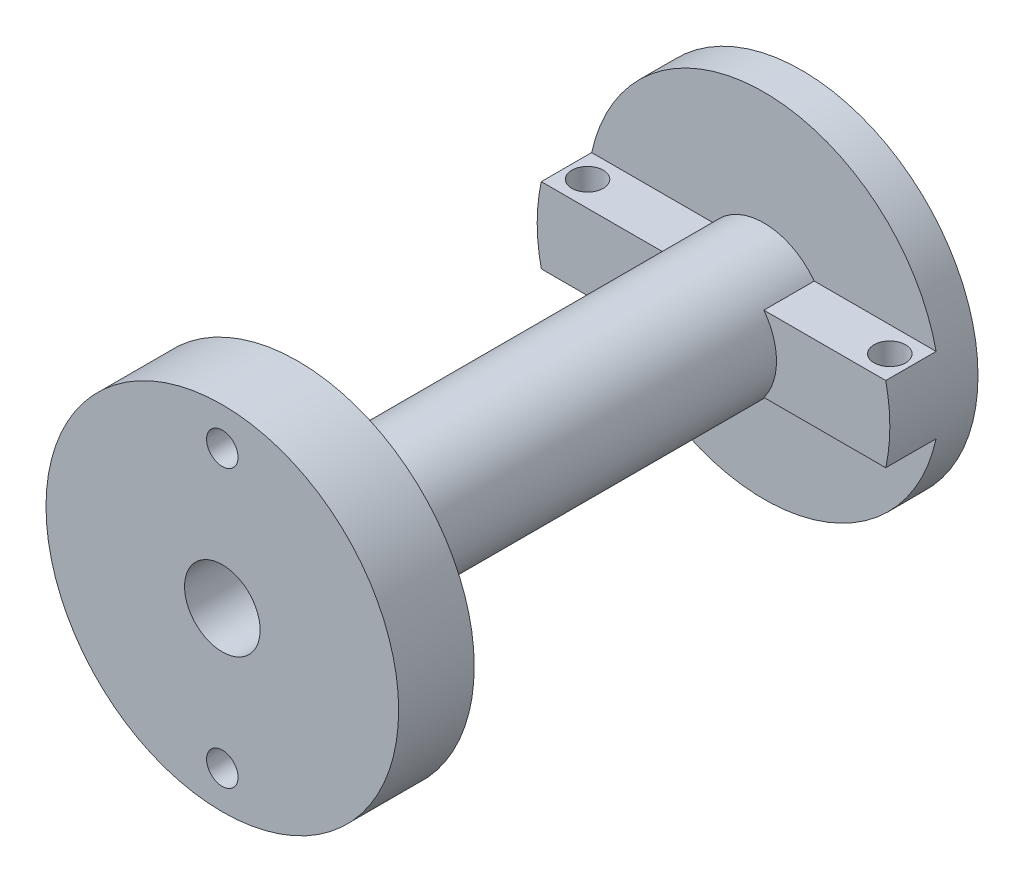
ISO-10303-21;
HEADER;
FILE_DESCRIPTION(('STEP AP214'),'2;1');
FILE_NAME('part.step','',(''),(''),'','','');
FILE_SCHEMA(('AUTOMOTIVE_DESIGN { 1 0 10303 214 1 1 1 1 }'));
ENDSEC;
DATA;
#1=APPLICATION_CONTEXT('core data for automotive mechanical design processes');
#2=APPLICATION_PROTOCOL_DEFINITION('international standard','automotive_design',2000,#1);
#3=PRODUCT_CONTEXT('',#1,'mechanical');
#4=PRODUCT('Part','Part','',(#3));
#5=PRODUCT_RELATED_PRODUCT_CATEGORY('part','',(#4));
#6=PRODUCT_DEFINITION_FORMATION('','',#4);
#7=PRODUCT_DEFINITION_CONTEXT('part definition',#1,'design');
#8=PRODUCT_DEFINITION('design','',#6,#7);
#9=PRODUCT_DEFINITION_SHAPE('','',#8);
#10=(LENGTH_UNIT() NAMED_UNIT(*) SI_UNIT(.MILLI.,.METRE.));
#11=(NAMED_UNIT(*) PLANE_ANGLE_UNIT() SI_UNIT($,.RADIAN.));
#12=(NAMED_UNIT(*) SI_UNIT($,.STERADIAN.) SOLID_ANGLE_UNIT());
#13=UNCERTAINTY_MEASURE_WITH_UNIT(LENGTH_MEASURE(1.E-05),#10,'distance_accuracy_value','');
#14=(GEOMETRIC_REPRESENTATION_CONTEXT(3) GLOBAL_UNCERTAINTY_ASSIGNED_CONTEXT((#13)) GLOBAL_UNIT_ASSIGNED_CONTEXT((#10,
#11,#12)) REPRESENTATION_CONTEXT('',''));
#15=CARTESIAN_POINT('',(0.,0.,0.));
#16=DIRECTION('',(0.,0.,1.));
#17=DIRECTION('',(1.,0.,0.));
#18=AXIS2_PLACEMENT_3D('',#15,#16,#17);
#19=CARTESIAN_POINT('',(0.,0.,1.5));
#20=DIRECTION('',(0.,0.,1.));
#21=DIRECTION('',(1.,0.,0.));
#22=AXIS2_PLACEMENT_3D('',#19,#20,#21);
#23=PLANE('',#22);
#24=CARTESIAN_POINT('',(0.,0.,1.5));
#25=DIRECTION('',(0.,0.,1.));
#26=DIRECTION('',(1.,0.,0.));
#27=AXIS2_PLACEMENT_3D('',#24,#25,#26);
#28=CIRCLE('',#27,7.);
#29=CARTESIAN_POINT('',(-6.83739716558867,-1.5,1.5));
#30=VERTEX_POINT('',#29);
#31=CARTESIAN_POINT('',(6.83739716558867,-1.5,1.5));
#32=VERTEX_POINT('',#31);
#33=EDGE_CURVE('E127',#30,#32,#28,.T.);
#34=ORIENTED_EDGE('',*,*,#33,.T.);
#35=DIRECTION('',(1.,0.,0.));
#36=VECTOR('',#35,1.);
#37=CARTESIAN_POINT('',(6.83739716558867,-1.5,1.5));
#38=LINE('',#37,#36);
#39=CARTESIAN_POINT('',(2.,-1.5,1.5));
#40=VERTEX_POINT('',#39);
#41=EDGE_CURVE('E252',#40,#32,#38,.T.);
#42=ORIENTED_EDGE('',*,*,#41,.F.);
#43=CARTESIAN_POINT('',(0.,0.,1.5));
#44=DIRECTION('',(0.,0.,1.));
#45=DIRECTION('',(1.,0.,0.));
#46=AXIS2_PLACEMENT_3D('',#43,#44,#45);
#47=CIRCLE('',#46,2.5);
#48=CARTESIAN_POINT('',(-2.,-1.5,1.5));
#49=VERTEX_POINT('',#48);
#50=EDGE_CURVE('E46',#49,#40,#47,.T.);
#51=ORIENTED_EDGE('',*,*,#50,.F.);
#52=EDGE_CURVE('E254',#30,#49,#38,.T.);
#53=ORIENTED_EDGE('',*,*,#52,.F.);
#54=EDGE_LOOP('',(#34,#42,#51,#53));
#55=FACE_BOUND('',#54,.T.);
#56=ADVANCED_FACE('F37',(#55),#23,.T.);
#57=CARTESIAN_POINT('',(6.83739716558867,1.5,1.5));
#58=VERTEX_POINT('',#57);
#59=CARTESIAN_POINT('',(-6.83739716558867,1.5,1.5));
#60=VERTEX_POINT('',#59);
#61=EDGE_CURVE('E171',#58,#60,#28,.T.);
#62=ORIENTED_EDGE('',*,*,#61,.T.);
#63=DIRECTION('',(-1.,0.,0.));
#64=VECTOR('',#63,1.);
#65=CARTESIAN_POINT('',(6.83739716558867,1.5,1.5));
#66=LINE('',#65,#64);
#67=CARTESIAN_POINT('',(-2.,1.5,1.5));
#68=VERTEX_POINT('',#67);
#69=EDGE_CURVE('E267',#68,#60,#66,.T.);
#70=ORIENTED_EDGE('',*,*,#69,.F.);
#71=CARTESIAN_POINT('',(2.,1.5,1.5));
#72=VERTEX_POINT('',#71);
#73=EDGE_CURVE('E11',#72,#68,#47,.T.);
#74=ORIENTED_EDGE('',*,*,#73,.F.);
#75=EDGE_CURVE('E120',#58,#72,#66,.T.);
#76=ORIENTED_EDGE('',*,*,#75,.F.);
#77=EDGE_LOOP('',(#62,#70,#74,#76));
#78=FACE_BOUND('',#77,.T.);
#79=ADVANCED_FACE('F197',(#78),#23,.T.);
#80=CARTESIAN_POINT('',(0.,0.,20.));
#81=DIRECTION('',(0.,0.,-1.));
#82=DIRECTION('',(-1.,0.,0.));
#83=AXIS2_PLACEMENT_3D('',#80,#81,#82);
#84=CYLINDRICAL_SURFACE('',#83,2.5);
#85=CARTESIAN_POINT('',(0.,0.,20.));
#86=DIRECTION('',(0.,0.,1.));
#87=DIRECTION('',(1.,0.,0.));
#88=AXIS2_PLACEMENT_3D('',#85,#86,#87);
#89=CIRCLE('',#88,2.5);
#90=CARTESIAN_POINT('',(2.5,0.,20.));
#91=VERTEX_POINT('',#90);
#92=EDGE_CURVE('E167',#91,#91,#89,.T.);
#93=ORIENTED_EDGE('',*,*,#92,.F.);
#94=EDGE_LOOP('',(#93));
#95=FACE_BOUND('',#94,.T.);
#96=DIRECTION('',(0.,0.,-1.));
#97=VECTOR('',#96,1.);
#98=CARTESIAN_POINT('',(-2.,-1.5,20.));
#99=LINE('',#98,#97);
#100=CARTESIAN_POINT('',(-2.,-1.5,3.5));
#101=VERTEX_POINT('',#100);
#102=EDGE_CURVE('E107',#49,#101,#99,.F.);
#103=ORIENTED_EDGE('',*,*,#102,.F.);
#104=ORIENTED_EDGE('',*,*,#50,.T.);
#105=DIRECTION('',(0.,0.,-1.));
#106=VECTOR('',#105,1.);
#107=CARTESIAN_POINT('',(2.,-1.5,20.));
#108=LINE('',#107,#106);
#109=CARTESIAN_POINT('',(2.,-1.5,3.5));
#110=VERTEX_POINT('',#109);
#111=EDGE_CURVE('E143',#110,#40,#108,.T.);
#112=ORIENTED_EDGE('',*,*,#111,.F.);
#113=CARTESIAN_POINT('',(0.,0.,3.5));
#114=DIRECTION('',(0.,0.,1.));
#115=DIRECTION('',(1.,0.,0.));
#116=AXIS2_PLACEMENT_3D('',#113,#114,#115);
#117=CIRCLE('',#116,2.5);
#118=CARTESIAN_POINT('',(2.,1.5,3.5));
#119=VERTEX_POINT('',#118);
#120=EDGE_CURVE('E128',#110,#119,#117,.T.);
#121=ORIENTED_EDGE('',*,*,#120,.T.);
#122=DIRECTION('',(0.,0.,-1.));
#123=VECTOR('',#122,1.);
#124=CARTESIAN_POINT('',(2.,1.5,20.));
#125=LINE('',#124,#123);
#126=EDGE_CURVE('E138',#72,#119,#125,.F.);
#127=ORIENTED_EDGE('',*,*,#126,.F.);
#128=ORIENTED_EDGE('',*,*,#73,.T.);
#129=DIRECTION('',(0.,0.,-1.));
#130=VECTOR('',#129,1.);
#131=CARTESIAN_POINT('',(-2.,1.5,20.));
#132=LINE('',#131,#130);
#133=CARTESIAN_POINT('',(-2.,1.5,3.5));
#134=VERTEX_POINT('',#133);
#135=EDGE_CURVE('E140',#134,#68,#132,.T.);
#136=ORIENTED_EDGE('',*,*,#135,.F.);
#137=EDGE_CURVE('E132',#134,#101,#117,.T.);
#138=ORIENTED_EDGE('',*,*,#137,.T.);
#139=EDGE_LOOP('',(#103,#104,#112,#121,#127,#128,#136,#138));
#140=FACE_BOUND('',#139,.T.);
#141=ADVANCED_FACE('F193',(#95,#140),#84,.T.);
#142=CARTESIAN_POINT('',(0.,0.,1.5));
#143=DIRECTION('',(0.,0.,-1.));
#144=DIRECTION('',(-1.,0.,0.));
#145=AXIS2_PLACEMENT_3D('',#142,#143,#144);
#146=CYLINDRICAL_SURFACE('',#145,7.);
#147=ORIENTED_EDGE('',*,*,#61,.F.);
#148=DIRECTION('',(0.,0.,-1.));
#149=VECTOR('',#148,1.);
#150=CARTESIAN_POINT('',(6.83739716558867,1.5,3.5));
#151=LINE('',#150,#149);
#152=CARTESIAN_POINT('',(6.83739716558867,1.5,3.5));
#153=VERTEX_POINT('',#152);
#154=EDGE_CURVE('E134',#153,#58,#151,.T.);
#155=ORIENTED_EDGE('',*,*,#154,.F.);
#156=CARTESIAN_POINT('',(0.,0.,3.5));
#157=DIRECTION('',(0.,0.,1.));
#158=DIRECTION('',(1.,0.,0.));
#159=AXIS2_PLACEMENT_3D('',#156,#157,#158);
#160=CIRCLE('',#159,7.);
#161=CARTESIAN_POINT('',(6.83739716558867,-1.5,3.5));
#162=VERTEX_POINT('',#161);
#163=EDGE_CURVE('E109',#162,#153,#160,.T.);
#164=ORIENTED_EDGE('',*,*,#163,.F.);
#165=DIRECTION('',(0.,0.,-1.));
#166=VECTOR('',#165,1.);
#167=CARTESIAN_POINT('',(6.83739716558867,-1.5,3.5));
#168=LINE('',#167,#166);
#169=EDGE_CURVE('E129',#162,#32,#168,.T.);
#170=ORIENTED_EDGE('',*,*,#169,.T.);
#171=ORIENTED_EDGE('',*,*,#33,.F.);
#172=DIRECTION('',(0.,0.,-1.));
#173=VECTOR('',#172,1.);
#174=CARTESIAN_POINT('',(-6.83739716558867,-1.5,3.5));
#175=LINE('',#174,#173);
#176=CARTESIAN_POINT('',(-6.83739716558867,-1.5,3.5));
#177=VERTEX_POINT('',#176);
#178=EDGE_CURVE('E104',#177,#30,#175,.T.);
#179=ORIENTED_EDGE('',*,*,#178,.F.);
#180=CARTESIAN_POINT('',(0.,0.,3.5));
#181=DIRECTION('',(0.,0.,1.));
#182=DIRECTION('',(1.,0.,0.));
#183=AXIS2_PLACEMENT_3D('',#180,#181,#182);
#184=CIRCLE('',#183,7.);
#185=CARTESIAN_POINT('',(-6.83739716558867,1.5,3.5));
#186=VERTEX_POINT('',#185);
#187=EDGE_CURVE('E113',#186,#177,#184,.T.);
#188=ORIENTED_EDGE('',*,*,#187,.F.);
#189=DIRECTION('',(0.,0.,-1.));
#190=VECTOR('',#189,1.);
#191=CARTESIAN_POINT('',(-6.83739716558867,1.5,3.5));
#192=LINE('',#191,#190);
#193=EDGE_CURVE('E265',#186,#60,#192,.T.);
#194=ORIENTED_EDGE('',*,*,#193,.T.);
#195=EDGE_LOOP('',(#147,#155,#164,#170,#171,#179,#188,#194));
#196=FACE_BOUND('',#195,.T.);
#197=CARTESIAN_POINT('',(0.,0.,0.));
#198=DIRECTION('',(0.,0.,1.));
#199=DIRECTION('',(1.,0.,0.));
#200=AXIS2_PLACEMENT_3D('',#197,#198,#199);
#201=CIRCLE('',#200,7.);
#202=CARTESIAN_POINT('',(7.,0.,0.));
#203=VERTEX_POINT('',#202);
#204=EDGE_CURVE('E41',#203,#203,#201,.T.);
#205=ORIENTED_EDGE('',*,*,#204,.T.);
#206=EDGE_LOOP('',(#205));
#207=FACE_BOUND('',#206,.T.);
#208=ADVANCED_FACE('F39',(#196,#207),#146,.T.);
#209=CARTESIAN_POINT('',(0.,0.,0.));
#210=DIRECTION('',(0.,0.,1.));
#211=DIRECTION('',(1.,0.,0.));
#212=AXIS2_PLACEMENT_3D('',#209,#210,#211);
#213=PLANE('',#212);
#214=CARTESIAN_POINT('',(0.,0.,0.));
#215=DIRECTION('',(0.,0.,-1.));
#216=DIRECTION('',(-1.,0.,0.));
#217=AXIS2_PLACEMENT_3D('',#214,#215,#216);
#218=CIRCLE('',#217,1.5);
#219=CARTESIAN_POINT('',(-1.5,0.,0.));
#220=VERTEX_POINT('',#219);
#221=EDGE_CURVE('E158',#220,#220,#218,.T.);
#222=ORIENTED_EDGE('',*,*,#221,.F.);
#223=EDGE_LOOP('',(#222));
#224=FACE_BOUND('',#223,.T.);
#225=ORIENTED_EDGE('',*,*,#204,.F.);
#226=EDGE_LOOP('',(#225));
#227=FACE_BOUND('',#226,.T.);
#228=ADVANCED_FACE('F182',(#224,#227),#213,.F.);
#229=CARTESIAN_POINT('',(0.,0.,23.));
#230=DIRECTION('',(0.,0.,-1.));
#231=DIRECTION('',(-1.,0.,0.));
#232=AXIS2_PLACEMENT_3D('',#229,#230,#231);
#233=CYLINDRICAL_SURFACE('',#232,7.);
#234=CARTESIAN_POINT('',(0.,0.,23.));
#235=DIRECTION('',(0.,0.,1.));
#236=DIRECTION('',(1.,0.,0.));
#237=AXIS2_PLACEMENT_3D('',#234,#235,#236);
#238=CIRCLE('',#237,7.);
#239=CARTESIAN_POINT('',(7.,0.,23.));
#240=VERTEX_POINT('',#239);
#241=EDGE_CURVE('E164',#240,#240,#238,.T.);
#242=ORIENTED_EDGE('',*,*,#241,.F.);
#243=EDGE_LOOP('',(#242));
#244=FACE_BOUND('',#243,.T.);
#245=CARTESIAN_POINT('',(0.,0.,20.));
#246=DIRECTION('',(0.,0.,1.));
#247=DIRECTION('',(1.,0.,0.));
#248=AXIS2_PLACEMENT_3D('',#245,#246,#247);
#249=CIRCLE('',#248,7.);
#250=CARTESIAN_POINT('',(7.,0.,20.));
#251=VERTEX_POINT('',#250);
#252=EDGE_CURVE('E161',#251,#251,#249,.T.);
#253=ORIENTED_EDGE('',*,*,#252,.T.);
#254=EDGE_LOOP('',(#253));
#255=FACE_BOUND('',#254,.T.);
#256=ADVANCED_FACE('F184',(#244,#255),#233,.T.);
#257=CARTESIAN_POINT('',(0.,0.,23.));
#258=DIRECTION('',(0.,0.,1.));
#259=DIRECTION('',(1.,0.,0.));
#260=AXIS2_PLACEMENT_3D('',#257,#258,#259);
#261=PLANE('',#260);
#262=CARTESIAN_POINT('',(0.,5.5,23.));
#263=DIRECTION('',(0.,0.,1.));
#264=DIRECTION('',(1.,0.,0.));
#265=AXIS2_PLACEMENT_3D('',#262,#263,#264);
#266=CIRCLE('',#265,0.625);
#267=CARTESIAN_POINT('',(0.625,5.5,23.));
#268=VERTEX_POINT('',#267);
#269=EDGE_CURVE('E149',#268,#268,#266,.T.);
#270=ORIENTED_EDGE('',*,*,#269,.F.);
#271=EDGE_LOOP('',(#270));
#272=FACE_BOUND('',#271,.T.);
#273=CARTESIAN_POINT('',(0.,-5.5,23.));
#274=DIRECTION('',(0.,0.,1.));
#275=DIRECTION('',(-1.,0.,0.));
#276=AXIS2_PLACEMENT_3D('',#273,#274,#275);
#277=CIRCLE('',#276,0.625);
#278=CARTESIAN_POINT('',(-0.625,-5.5,23.));
#279=VERTEX_POINT('',#278);
#280=EDGE_CURVE('E145',#279,#279,#277,.T.);
#281=ORIENTED_EDGE('',*,*,#280,.F.);
#282=EDGE_LOOP('',(#281));
#283=FACE_BOUND('',#282,.T.);
#284=CARTESIAN_POINT('',(0.,0.,23.));
#285=DIRECTION('',(0.,0.,1.));
#286=DIRECTION('',(1.,0.,0.));
#287=AXIS2_PLACEMENT_3D('',#284,#285,#286);
#288=CIRCLE('',#287,1.5);
#289=CARTESIAN_POINT('',(1.5,0.,23.));
#290=VERTEX_POINT('',#289);
#291=EDGE_CURVE('E153',#290,#290,#288,.F.);
#292=ORIENTED_EDGE('',*,*,#291,.T.);
#293=EDGE_LOOP('',(#292));
#294=FACE_BOUND('',#293,.T.);
#295=ORIENTED_EDGE('',*,*,#241,.T.);
#296=EDGE_LOOP('',(#295));
#297=FACE_BOUND('',#296,.T.);
#298=ADVANCED_FACE('F190',(#272,#283,#294,#297),#261,.T.);
#299=CARTESIAN_POINT('',(0.,0.,20.));
#300=DIRECTION('',(0.,0.,1.));
#301=DIRECTION('',(1.,0.,0.));
#302=AXIS2_PLACEMENT_3D('',#299,#300,#301);
#303=PLANE('',#302);
#304=CARTESIAN_POINT('',(0.,5.5,20.));
#305=DIRECTION('',(0.,0.,1.));
#306=DIRECTION('',(1.,0.,0.));
#307=AXIS2_PLACEMENT_3D('',#304,#305,#306);
#308=CIRCLE('',#307,0.625);
#309=CARTESIAN_POINT('',(0.625,5.5,20.));
#310=VERTEX_POINT('',#309);
#311=EDGE_CURVE('E146',#310,#310,#308,.F.);
#312=ORIENTED_EDGE('',*,*,#311,.F.);
#313=EDGE_LOOP('',(#312));
#314=FACE_BOUND('',#313,.T.);
#315=CARTESIAN_POINT('',(0.,-5.5,20.));
#316=DIRECTION('',(0.,0.,1.));
#317=DIRECTION('',(1.,0.,0.));
#318=AXIS2_PLACEMENT_3D('',#315,#316,#317);
#319=CIRCLE('',#318,0.625);
#320=CARTESIAN_POINT('',(0.625,-5.5,20.));
#321=VERTEX_POINT('',#320);
#322=EDGE_CURVE('E150',#321,#321,#319,.F.);
#323=ORIENTED_EDGE('',*,*,#322,.F.);
#324=EDGE_LOOP('',(#323));
#325=FACE_BOUND('',#324,.T.);
#326=ORIENTED_EDGE('',*,*,#92,.T.);
#327=EDGE_LOOP('',(#326));
#328=FACE_BOUND('',#327,.T.);
#329=ORIENTED_EDGE('',*,*,#252,.F.);
#330=EDGE_LOOP('',(#329));
#331=FACE_BOUND('',#330,.T.);
#332=ADVANCED_FACE('F205',(#314,#325,#328,#331),#303,.F.);
#333=CARTESIAN_POINT('',(0.,0.,23.001));
#334=DIRECTION('',(0.,0.,-1.));
#335=DIRECTION('',(-1.,0.,0.));
#336=AXIS2_PLACEMENT_3D('',#333,#334,#335);
#337=CYLINDRICAL_SURFACE('',#336,1.5);
#338=ORIENTED_EDGE('',*,*,#291,.F.);
#339=EDGE_LOOP('',(#338));
#340=FACE_BOUND('',#339,.T.);
#341=ORIENTED_EDGE('',*,*,#221,.T.);
#342=EDGE_LOOP('',(#341));
#343=FACE_BOUND('',#342,.T.);
#344=ADVANCED_FACE('F208',(#340,#343),#337,.F.);
#345=CARTESIAN_POINT('',(0.,-5.5,-0.001000000000001));
#346=DIRECTION('',(0.,0.,1.));
#347=DIRECTION('',(1.,0.,0.));
#348=AXIS2_PLACEMENT_3D('',#345,#346,#347);
#349=CYLINDRICAL_SURFACE('',#348,0.625);
#350=ORIENTED_EDGE('',*,*,#280,.T.);
#351=EDGE_LOOP('',(#350));
#352=FACE_BOUND('',#351,.T.);
#353=ORIENTED_EDGE('',*,*,#322,.T.);
#354=EDGE_LOOP('',(#353));
#355=FACE_BOUND('',#354,.T.);
#356=ADVANCED_FACE('F215',(#352,#355),#349,.F.);
#357=CARTESIAN_POINT('',(0.,5.5,-0.001000000000001));
#358=DIRECTION('',(0.,0.,1.));
#359=DIRECTION('',(1.,0.,0.));
#360=AXIS2_PLACEMENT_3D('',#357,#358,#359);
#361=CYLINDRICAL_SURFACE('',#360,0.625);
#362=ORIENTED_EDGE('',*,*,#269,.T.);
#363=EDGE_LOOP('',(#362));
#364=FACE_BOUND('',#363,.T.);
#365=ORIENTED_EDGE('',*,*,#311,.T.);
#366=EDGE_LOOP('',(#365));
#367=FACE_BOUND('',#366,.T.);
#368=ADVANCED_FACE('F219',(#364,#367),#361,.F.);
#369=CARTESIAN_POINT('',(0.,0.,3.5));
#370=DIRECTION('',(0.,0.,1.));
#371=DIRECTION('',(1.,0.,0.));
#372=AXIS2_PLACEMENT_3D('',#369,#370,#371);
#373=PLANE('',#372);
#374=ORIENTED_EDGE('',*,*,#120,.F.);
#375=DIRECTION('',(1.,0.,0.));
#376=VECTOR('',#375,1.);
#377=CARTESIAN_POINT('',(6.83739716558867,-1.5,3.5));
#378=LINE('',#377,#376);
#379=EDGE_CURVE('E110',#110,#162,#378,.T.);
#380=ORIENTED_EDGE('',*,*,#379,.T.);
#381=ORIENTED_EDGE('',*,*,#163,.T.);
#382=DIRECTION('',(-1.,0.,0.));
#383=VECTOR('',#382,1.);
#384=CARTESIAN_POINT('',(6.83739716558867,1.5,3.5));
#385=LINE('',#384,#383);
#386=EDGE_CURVE('E62',#153,#119,#385,.T.);
#387=ORIENTED_EDGE('',*,*,#386,.T.);
#388=EDGE_LOOP('',(#374,#380,#381,#387));
#389=FACE_BOUND('',#388,.T.);
#390=ADVANCED_FACE('F223',(#389),#373,.T.);
#391=CARTESIAN_POINT('',(6.83739716558867,1.5,3.5));
#392=DIRECTION('',(0.,-1.,0.));
#393=DIRECTION('',(0.,0.,-1.));
#394=AXIS2_PLACEMENT_3D('',#391,#392,#393);
#395=PLANE('',#394);
#396=CARTESIAN_POINT('',(6.,1.5,2.5));
#397=DIRECTION('',(0.,-1.,0.));
#398=DIRECTION('',(0.,0.,-1.));
#399=AXIS2_PLACEMENT_3D('',#396,#397,#398);
#400=CIRCLE('',#399,0.625);
#401=CARTESIAN_POINT('',(6.,1.5,1.875));
#402=VERTEX_POINT('',#401);
#403=EDGE_CURVE('E259',#402,#402,#400,.F.);
#404=ORIENTED_EDGE('',*,*,#403,.F.);
#405=EDGE_LOOP('',(#404));
#406=FACE_BOUND('',#405,.T.);
#407=ORIENTED_EDGE('',*,*,#75,.T.);
#408=ORIENTED_EDGE('',*,*,#126,.T.);
#409=ORIENTED_EDGE('',*,*,#386,.F.);
#410=ORIENTED_EDGE('',*,*,#154,.T.);
#411=EDGE_LOOP('',(#407,#408,#409,#410));
#412=FACE_BOUND('',#411,.T.);
#413=ADVANCED_FACE('F228',(#406,#412),#395,.F.);
#414=CARTESIAN_POINT('',(6.83739716558867,-1.5,3.5));
#415=DIRECTION('',(0.,1.,0.));
#416=DIRECTION('',(0.,0.,1.));
#417=AXIS2_PLACEMENT_3D('',#414,#415,#416);
#418=PLANE('',#417);
#419=CARTESIAN_POINT('',(6.,-1.5,2.5));
#420=DIRECTION('',(0.,-1.,0.));
#421=DIRECTION('',(-1.,0.,0.));
#422=AXIS2_PLACEMENT_3D('',#419,#420,#421);
#423=CIRCLE('',#422,0.625);
#424=CARTESIAN_POINT('',(5.375,-1.5,2.5));
#425=VERTEX_POINT('',#424);
#426=EDGE_CURVE('E256',#425,#425,#423,.T.);
#427=ORIENTED_EDGE('',*,*,#426,.F.);
#428=EDGE_LOOP('',(#427));
#429=FACE_BOUND('',#428,.T.);
#430=ORIENTED_EDGE('',*,*,#379,.F.);
#431=ORIENTED_EDGE('',*,*,#111,.T.);
#432=ORIENTED_EDGE('',*,*,#41,.T.);
#433=ORIENTED_EDGE('',*,*,#169,.F.);
#434=EDGE_LOOP('',(#430,#431,#432,#433));
#435=FACE_BOUND('',#434,.T.);
#436=ADVANCED_FACE('F225',(#429,#435),#418,.F.);
#437=CARTESIAN_POINT('',(-6.,-1.5,2.5));
#438=DIRECTION('',(0.,-1.,0.));
#439=DIRECTION('',(1.,0.,0.));
#440=AXIS2_PLACEMENT_3D('',#437,#438,#439);
#441=CIRCLE('',#440,0.625);
#442=CARTESIAN_POINT('',(-5.375,-1.5,2.5));
#443=VERTEX_POINT('',#442);
#444=EDGE_CURVE('E248',#443,#443,#441,.T.);
#445=ORIENTED_EDGE('',*,*,#444,.F.);
#446=EDGE_LOOP('',(#445));
#447=FACE_BOUND('',#446,.T.);
#448=ORIENTED_EDGE('',*,*,#52,.T.);
#449=ORIENTED_EDGE('',*,*,#102,.T.);
#450=EDGE_CURVE('E54',#177,#101,#378,.T.);
#451=ORIENTED_EDGE('',*,*,#450,.F.);
#452=ORIENTED_EDGE('',*,*,#178,.T.);
#453=EDGE_LOOP('',(#448,#449,#451,#452));
#454=FACE_BOUND('',#453,.T.);
#455=ADVANCED_FACE('F102',(#447,#454),#418,.F.);
#456=CARTESIAN_POINT('',(-6.,1.5,2.5));
#457=DIRECTION('',(0.,-1.,0.));
#458=DIRECTION('',(0.,0.,-1.));
#459=AXIS2_PLACEMENT_3D('',#456,#457,#458);
#460=CIRCLE('',#459,0.625);
#461=CARTESIAN_POINT('',(-6.,1.5,1.875));
#462=VERTEX_POINT('',#461);
#463=EDGE_CURVE('E251',#462,#462,#460,.F.);
#464=ORIENTED_EDGE('',*,*,#463,.F.);
#465=EDGE_LOOP('',(#464));
#466=FACE_BOUND('',#465,.T.);
#467=EDGE_CURVE('E116',#134,#186,#385,.T.);
#468=ORIENTED_EDGE('',*,*,#467,.F.);
#469=ORIENTED_EDGE('',*,*,#135,.T.);
#470=ORIENTED_EDGE('',*,*,#69,.T.);
#471=ORIENTED_EDGE('',*,*,#193,.F.);
#472=EDGE_LOOP('',(#468,#469,#470,#471));
#473=FACE_BOUND('',#472,.T.);
#474=ADVANCED_FACE('F230',(#466,#473),#395,.F.);
#475=ORIENTED_EDGE('',*,*,#137,.F.);
#476=ORIENTED_EDGE('',*,*,#467,.T.);
#477=ORIENTED_EDGE('',*,*,#187,.T.);
#478=ORIENTED_EDGE('',*,*,#450,.T.);
#479=EDGE_LOOP('',(#475,#476,#477,#478));
#480=FACE_BOUND('',#479,.T.);
#481=ADVANCED_FACE('F114',(#480),#373,.T.);
#482=CARTESIAN_POINT('',(-6.,7.001,2.5));
#483=DIRECTION('',(0.,-1.,0.));
#484=DIRECTION('',(1.,0.,0.));
#485=AXIS2_PLACEMENT_3D('',#482,#483,#484);
#486=CYLINDRICAL_SURFACE('',#485,0.625);
#487=ORIENTED_EDGE('',*,*,#444,.T.);
#488=EDGE_LOOP('',(#487));
#489=FACE_BOUND('',#488,.T.);
#490=ORIENTED_EDGE('',*,*,#463,.T.);
#491=EDGE_LOOP('',(#490));
#492=FACE_BOUND('',#491,.T.);
#493=ADVANCED_FACE('F236',(#489,#492),#486,.F.);
#494=CARTESIAN_POINT('',(6.,7.001,2.5));
#495=DIRECTION('',(0.,-1.,0.));
#496=DIRECTION('',(1.,0.,0.));
#497=AXIS2_PLACEMENT_3D('',#494,#495,#496);
#498=CYLINDRICAL_SURFACE('',#497,0.625);
#499=ORIENTED_EDGE('',*,*,#426,.T.);
#500=EDGE_LOOP('',(#499));
#501=FACE_BOUND('',#500,.T.);
#502=ORIENTED_EDGE('',*,*,#403,.T.);
#503=EDGE_LOOP('',(#502));
#504=FACE_BOUND('',#503,.T.);
#505=ADVANCED_FACE('F237',(#501,#504),#498,.F.);
#506=CLOSED_SHELL('',(#56,#79,#141,#208,#228,#256,#298,#332,#344,#356,#368,#390,#413,#436,#455,
#474,#481,#493,#505));
#507=MANIFOLD_SOLID_BREP('B2',#506);
#508=ADVANCED_BREP_SHAPE_REPRESENTATION('',(#18,#507),#14);
#509=SHAPE_DEFINITION_REPRESENTATION(#9,#508);
ENDSEC;
END-ISO-10303-21;
